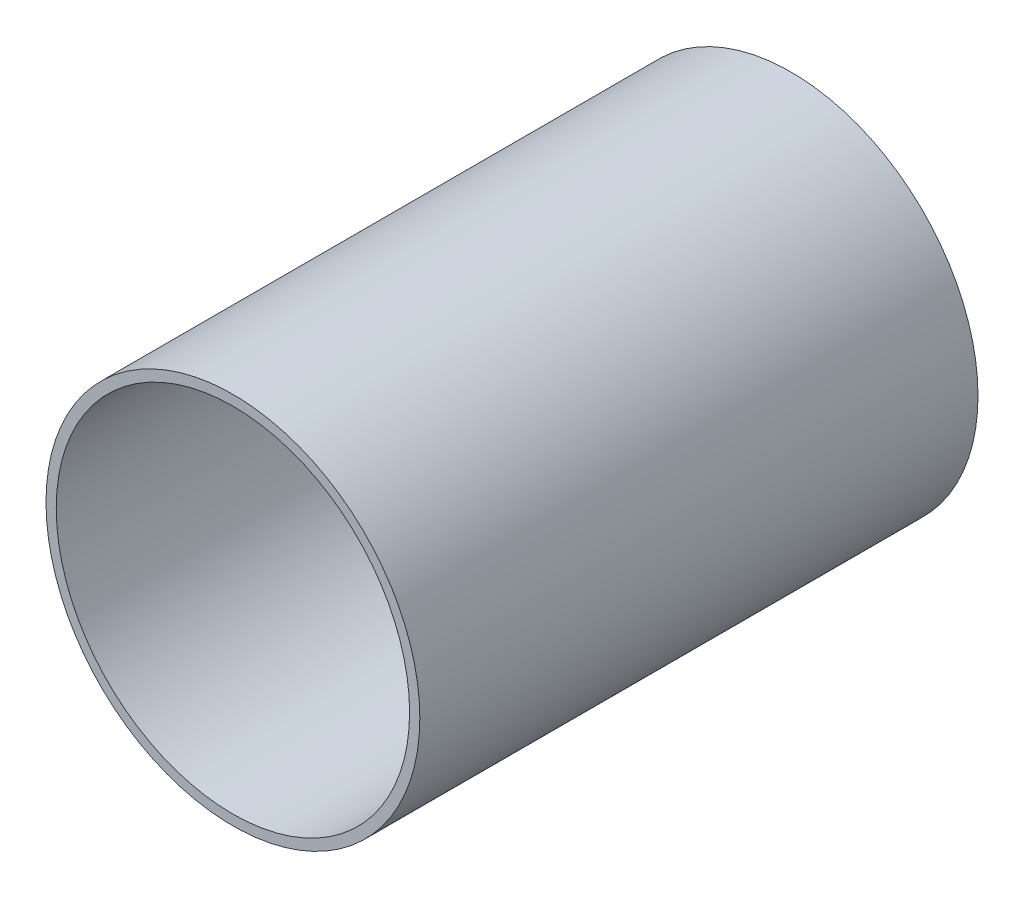
ISO-10303-21;
HEADER;
FILE_DESCRIPTION(('STEP AP214'),'2;1');
FILE_NAME('part.step','',(''),(''),'','','');
FILE_SCHEMA(('AUTOMOTIVE_DESIGN { 1 0 10303 214 1 1 1 1 }'));
ENDSEC;
DATA;
#1=APPLICATION_CONTEXT('core data for automotive mechanical design processes');
#2=APPLICATION_PROTOCOL_DEFINITION('international standard','automotive_design',2000,#1);
#3=PRODUCT_CONTEXT('',#1,'mechanical');
#4=PRODUCT('Part','Part','',(#3));
#5=PRODUCT_RELATED_PRODUCT_CATEGORY('part','',(#4));
#6=PRODUCT_DEFINITION_FORMATION('','',#4);
#7=PRODUCT_DEFINITION_CONTEXT('part definition',#1,'design');
#8=PRODUCT_DEFINITION('design','',#6,#7);
#9=PRODUCT_DEFINITION_SHAPE('','',#8);
#10=(LENGTH_UNIT() NAMED_UNIT(*) SI_UNIT(.MILLI.,.METRE.));
#11=(NAMED_UNIT(*) PLANE_ANGLE_UNIT() SI_UNIT($,.RADIAN.));
#12=(NAMED_UNIT(*) SI_UNIT($,.STERADIAN.) SOLID_ANGLE_UNIT());
#13=UNCERTAINTY_MEASURE_WITH_UNIT(LENGTH_MEASURE(1.E-05),#10,'distance_accuracy_value','');
#14=(GEOMETRIC_REPRESENTATION_CONTEXT(3) GLOBAL_UNCERTAINTY_ASSIGNED_CONTEXT((#13)) GLOBAL_UNIT_ASSIGNED_CONTEXT((#10,
#11,#12)) REPRESENTATION_CONTEXT('',''));
#15=CARTESIAN_POINT('',(0.,0.,0.));
#16=DIRECTION('',(0.,0.,1.));
#17=DIRECTION('',(1.,0.,0.));
#18=AXIS2_PLACEMENT_3D('',#15,#16,#17);
#19=CARTESIAN_POINT('',(0.,0.,109.));
#20=DIRECTION('',(0.,0.,-1.));
#21=DIRECTION('',(-1.,0.,0.));
#22=AXIS2_PLACEMENT_3D('',#19,#20,#21);
#23=CYLINDRICAL_SURFACE('',#22,36.5);
#24=CARTESIAN_POINT('',(0.,0.,109.));
#25=DIRECTION('',(0.,0.,1.));
#26=DIRECTION('',(1.,0.,0.));
#27=AXIS2_PLACEMENT_3D('',#24,#25,#26);
#28=CIRCLE('',#27,36.5);
#29=CARTESIAN_POINT('',(36.5,0.,109.));
#30=VERTEX_POINT('',#29);
#31=EDGE_CURVE('E10',#30,#30,#28,.T.);
#32=ORIENTED_EDGE('',*,*,#31,.F.);
#33=EDGE_LOOP('',(#32));
#34=FACE_BOUND('',#33,.T.);
#35=CARTESIAN_POINT('',(0.,0.,0.));
#36=DIRECTION('',(0.,0.,1.));
#37=DIRECTION('',(1.,0.,0.));
#38=AXIS2_PLACEMENT_3D('',#35,#36,#37);
#39=CIRCLE('',#38,36.5);
#40=CARTESIAN_POINT('',(36.5,0.,0.));
#41=VERTEX_POINT('',#40);
#42=EDGE_CURVE('E40',#41,#41,#39,.T.);
#43=ORIENTED_EDGE('',*,*,#42,.T.);
#44=EDGE_LOOP('',(#43));
#45=FACE_BOUND('',#44,.T.);
#46=ADVANCED_FACE('F37',(#34,#45),#23,.T.);
#47=CARTESIAN_POINT('',(0.,0.,109.));
#48=DIRECTION('',(0.,0.,1.));
#49=DIRECTION('',(1.,0.,0.));
#50=AXIS2_PLACEMENT_3D('',#47,#48,#49);
#51=PLANE('',#50);
#52=CARTESIAN_POINT('',(0.,0.,109.));
#53=DIRECTION('',(0.,0.,1.));
#54=DIRECTION('',(1.,0.,0.));
#55=AXIS2_PLACEMENT_3D('',#52,#53,#54);
#56=CIRCLE('',#55,34.5);
#57=CARTESIAN_POINT('',(34.5,0.,109.));
#58=VERTEX_POINT('',#57);
#59=EDGE_CURVE('E47',#58,#58,#56,.T.);
#60=ORIENTED_EDGE('',*,*,#59,.F.);
#61=EDGE_LOOP('',(#60));
#62=FACE_BOUND('',#61,.T.);
#63=ORIENTED_EDGE('',*,*,#31,.T.);
#64=EDGE_LOOP('',(#63));
#65=FACE_BOUND('',#64,.T.);
#66=ADVANCED_FACE('F67',(#62,#65),#51,.T.);
#67=CARTESIAN_POINT('',(0.,0.,0.));
#68=DIRECTION('',(0.,0.,1.));
#69=DIRECTION('',(1.,0.,0.));
#70=AXIS2_PLACEMENT_3D('',#67,#68,#69);
#71=PLANE('',#70);
#72=ORIENTED_EDGE('',*,*,#42,.F.);
#73=EDGE_LOOP('',(#72));
#74=FACE_BOUND('',#73,.T.);
#75=ADVANCED_FACE('F59',(#74),#71,.F.);
#76=CARTESIAN_POINT('',(0.,0.,109.));
#77=DIRECTION('',(0.,0.,-1.));
#78=DIRECTION('',(-1.,0.,0.));
#79=AXIS2_PLACEMENT_3D('',#76,#77,#78);
#80=CYLINDRICAL_SURFACE('',#79,34.5);
#81=ORIENTED_EDGE('',*,*,#59,.T.);
#82=EDGE_LOOP('',(#81));
#83=FACE_BOUND('',#82,.T.);
#84=CARTESIAN_POINT('',(0.,0.,2.));
#85=DIRECTION('',(0.,0.,1.));
#86=DIRECTION('',(1.,0.,0.));
#87=AXIS2_PLACEMENT_3D('',#84,#85,#86);
#88=CIRCLE('',#87,34.5);
#89=CARTESIAN_POINT('',(34.5,0.,2.));
#90=VERTEX_POINT('',#89);
#91=EDGE_CURVE('E51',#90,#90,#88,.T.);
#92=ORIENTED_EDGE('',*,*,#91,.F.);
#93=EDGE_LOOP('',(#92));
#94=FACE_BOUND('',#93,.T.);
#95=ADVANCED_FACE('F57',(#83,#94),#80,.F.);
#96=CARTESIAN_POINT('',(0.,0.,2.));
#97=DIRECTION('',(0.,0.,1.));
#98=DIRECTION('',(1.,0.,0.));
#99=AXIS2_PLACEMENT_3D('',#96,#97,#98);
#100=PLANE('',#99);
#101=ORIENTED_EDGE('',*,*,#91,.T.);
#102=EDGE_LOOP('',(#101));
#103=FACE_BOUND('',#102,.T.);
#104=ADVANCED_FACE('F55',(#103),#100,.T.);
#105=CLOSED_SHELL('',(#46,#66,#75,#95,#104));
#106=MANIFOLD_SOLID_BREP('B2',#105);
#107=ADVANCED_BREP_SHAPE_REPRESENTATION('',(#18,#106),#14);
#108=SHAPE_DEFINITION_REPRESENTATION(#9,#107);
ENDSEC;
END-ISO-10303-21;
